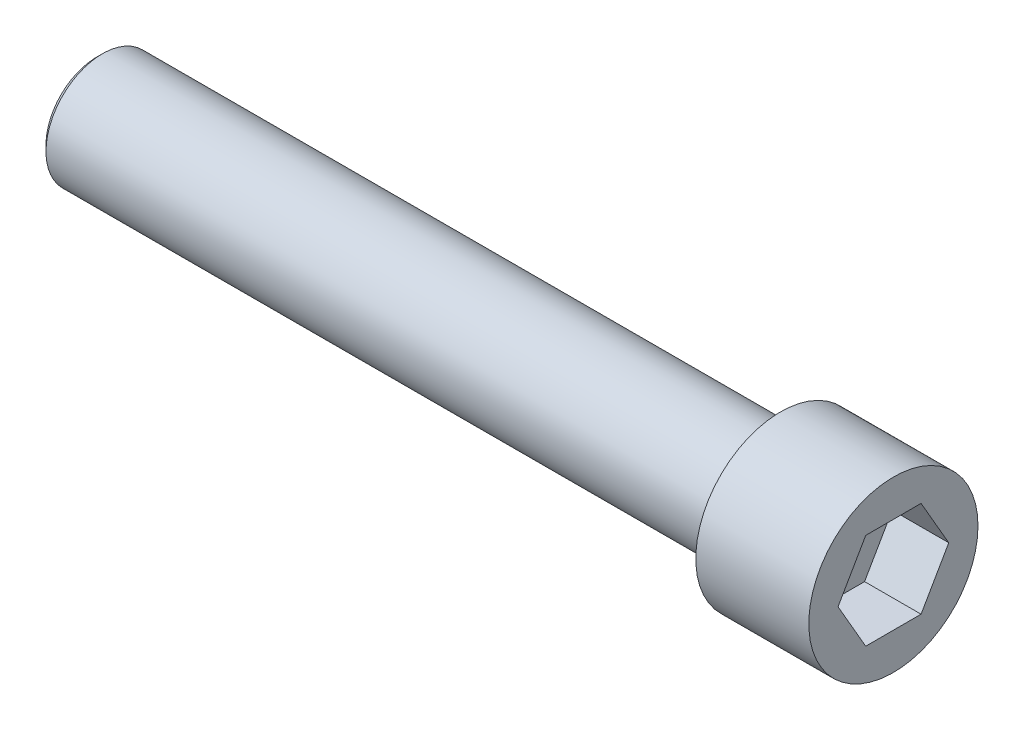
ISO-10303-21;
HEADER;
FILE_DESCRIPTION(('STEP AP214'),'2;1');
FILE_NAME('part.step','',(''),(''),'','','');
FILE_SCHEMA(('AUTOMOTIVE_DESIGN { 1 0 10303 214 1 1 1 1 }'));
ENDSEC;
DATA;
#1=APPLICATION_CONTEXT('core data for automotive mechanical design processes');
#2=APPLICATION_PROTOCOL_DEFINITION('international standard','automotive_design',2000,#1);
#3=PRODUCT_CONTEXT('',#1,'mechanical');
#4=PRODUCT('Part','Part','',(#3));
#5=PRODUCT_RELATED_PRODUCT_CATEGORY('part','',(#4));
#6=PRODUCT_DEFINITION_FORMATION('','',#4);
#7=PRODUCT_DEFINITION_CONTEXT('part definition',#1,'design');
#8=PRODUCT_DEFINITION('design','',#6,#7);
#9=PRODUCT_DEFINITION_SHAPE('','',#8);
#10=(LENGTH_UNIT() NAMED_UNIT(*) SI_UNIT(.MILLI.,.METRE.));
#11=(NAMED_UNIT(*) PLANE_ANGLE_UNIT() SI_UNIT($,.RADIAN.));
#12=(NAMED_UNIT(*) SI_UNIT($,.STERADIAN.) SOLID_ANGLE_UNIT());
#13=UNCERTAINTY_MEASURE_WITH_UNIT(LENGTH_MEASURE(1.E-05),#10,'distance_accuracy_value','');
#14=(GEOMETRIC_REPRESENTATION_CONTEXT(3) GLOBAL_UNCERTAINTY_ASSIGNED_CONTEXT((#13)) GLOBAL_UNIT_ASSIGNED_CONTEXT((#10,
#11,#12)) REPRESENTATION_CONTEXT('',''));
#15=CARTESIAN_POINT('',(0.,0.,0.));
#16=DIRECTION('',(0.,0.,1.));
#17=DIRECTION('',(1.,0.,0.));
#18=AXIS2_PLACEMENT_3D('',#15,#16,#17);
#19=CARTESIAN_POINT('',(-2985.09814387613,-2632.99425134609,-957.181157954976));
#20=DIRECTION('',(-0.99999962622111,9.96744033232361E-06,0.000864556701465126));
#21=DIRECTION('',(9.96744405744865E-06,0.999999999950325,0.));
#22=AXIS2_PLACEMENT_3D('',#19,#20,#21);
#23=PLANE('',#22);
#24=CARTESIAN_POINT('',(-2985.10203438085,-2632.99420649261,-961.681156272962));
#25=DIRECTION('',(-0.99999962622111,9.96744033232361E-06,0.000864556701465125));
#26=DIRECTION('',(0.000864556602115295,-9.96744034816775E-06,0.999999626221196));
#27=AXIS2_PLACEMENT_3D('',#24,#25,#26);
#28=CIRCLE('',#27,9.);
#29=CARTESIAN_POINT('',(-2985.10981539072,-2632.99411678565,-970.6811529094));
#30=VERTEX_POINT('',#29);
#31=EDGE_CURVE('E138',#30,#30,#28,.T.);
#32=ORIENTED_EDGE('',*,*,#31,.T.);
#33=EDGE_LOOP('',(#32));
#34=FACE_BOUND('',#33,.T.);
#35=ADVANCED_FACE('F17',(#34),#23,.T.);
#36=CARTESIAN_POINT('',(-2844.10936095089,-2632.99484626083,-971.618459251404));
#37=DIRECTION('',(-0.000743739953429566,0.500008632006878,-0.866020100672896));
#38=DIRECTION('',(-0.999999631229609,0.,0.000858801866818574));
#39=AXIS2_PLACEMENT_3D('',#36,#37,#38);
#40=PLANE('',#39);
#41=DIRECTION('',(0.000440917817272284,0.866020419978039,0.500008437701345));
#42=VECTOR('',#41,1.);
#43=CARTESIAN_POINT('',(-2854.10935721309,-2632.99474658641,-971.6098136844));
#44=LINE('',#43,#42);
#45=CARTESIAN_POINT('',(-2854.1093572131,-2632.99474658642,-971.60981368439));
#46=VERTEX_POINT('',#45);
#47=CARTESIAN_POINT('',(-2854.10502962475,-2624.49479550226,-966.702253580626));
#48=VERTEX_POINT('',#47);
#49=EDGE_CURVE('E49',#46,#48,#44,.T.);
#50=ORIENTED_EDGE('',*,*,#49,.F.);
#51=DIRECTION('',(-0.99999962622111,9.9674403323236E-06,0.000864556701465125));
#52=VECTOR('',#51,1.);
#53=CARTESIAN_POINT('',(-2844.10936095088,-2632.99484626082,-971.618459251414));
#54=LINE('',#53,#52);
#55=CARTESIAN_POINT('',(-2844.10936095089,-2632.99484626083,-971.618459251404));
#56=VERTEX_POINT('',#55);
#57=EDGE_CURVE('E157',#56,#46,#54,.T.);
#58=ORIENTED_EDGE('',*,*,#57,.F.);
#59=DIRECTION('',(-0.000440917817272284,-0.866020419978039,-0.500008437701345));
#60=VECTOR('',#59,1.);
#61=CARTESIAN_POINT('',(-2844.10503336253,-2624.49489517665,-966.71089914765));
#62=LINE('',#61,#60);
#63=CARTESIAN_POINT('',(-2844.10503336254,-2624.49489517666,-966.71089914764));
#64=VERTEX_POINT('',#63);
#65=EDGE_CURVE('E11',#64,#56,#62,.T.);
#66=ORIENTED_EDGE('',*,*,#65,.F.);
#67=DIRECTION('',(-0.99999962622111,9.9674403323236E-06,0.000864556701465125));
#68=VECTOR('',#67,1.);
#69=CARTESIAN_POINT('',(-2844.10503336253,-2624.49489517665,-966.71089914765));
#70=LINE('',#69,#68);
#71=EDGE_CURVE('E174',#64,#48,#70,.T.);
#72=ORIENTED_EDGE('',*,*,#71,.T.);
#73=EDGE_LOOP('',(#50,#58,#66,#72));
#74=FACE_BOUND('',#73,.T.);
#75=ADVANCED_FACE('F238',(#74),#40,.F.);
#76=CARTESIAN_POINT('',(-2844.09654777876,-2624.49499300663,-956.895948240038));
#77=DIRECTION('',(0.000753716007453621,0.499991367893773,0.866030059492102));
#78=DIRECTION('',(0.999998863787065,-0.00150745632718978,0.));
#79=AXIS2_PLACEMENT_3D('',#76,#77,#78);
#80=PLANE('',#79);
#81=DIRECTION('',(0.000423638784843571,-0.866030387418387,0.499991188520497));
#82=VECTOR('',#81,1.);
#83=CARTESIAN_POINT('',(-2854.09654404096,-2624.49489333222,-956.887302673014));
#84=LINE('',#83,#82);
#85=CARTESIAN_POINT('',(-2854.09654404097,-2624.49489333223,-956.887302673024));
#86=VERTEX_POINT('',#85);
#87=CARTESIAN_POINT('',(-2854.09238604554,-2632.99494224637,-951.979911869186));
#88=VERTEX_POINT('',#87);
#89=EDGE_CURVE('E152',#86,#88,#84,.T.);
#90=ORIENTED_EDGE('',*,*,#89,.F.);
#91=DIRECTION('',(-0.99999962622111,9.9674403323236E-06,0.000864556701465125));
#92=VECTOR('',#91,1.);
#93=CARTESIAN_POINT('',(-2844.09654777875,-2624.49499300662,-956.895948240028));
#94=LINE('',#93,#92);
#95=CARTESIAN_POINT('',(-2844.09654777876,-2624.49499300663,-956.895948240038));
#96=VERTEX_POINT('',#95);
#97=EDGE_CURVE('E167',#96,#86,#94,.T.);
#98=ORIENTED_EDGE('',*,*,#97,.F.);
#99=DIRECTION('',(-0.000423638784843571,0.866030387418387,-0.499991188520497));
#100=VECTOR('',#99,1.);
#101=CARTESIAN_POINT('',(-2844.09238978332,-2632.99504192079,-951.988557436191));
#102=LINE('',#101,#100);
#103=CARTESIAN_POINT('',(-2844.09238978333,-2632.99504192078,-951.988557436201));
#104=VERTEX_POINT('',#103);
#105=EDGE_CURVE('E29',#104,#96,#102,.T.);
#106=ORIENTED_EDGE('',*,*,#105,.F.);
#107=DIRECTION('',(-0.99999962622111,9.9674403323236E-06,0.000864556701465125));
#108=VECTOR('',#107,1.);
#109=CARTESIAN_POINT('',(-2844.09238978332,-2632.99504192079,-951.988557436191));
#110=LINE('',#109,#108);
#111=EDGE_CURVE('E187',#104,#88,#110,.T.);
#112=ORIENTED_EDGE('',*,*,#111,.T.);
#113=EDGE_LOOP('',(#90,#98,#106,#112));
#114=FACE_BOUND('',#113,.T.);
#115=ADVANCED_FACE('F19',(#114),#80,.F.);
#116=CARTESIAN_POINT('',(-2844.09439119259,-2632.9950188466,-954.303511147144));
#117=DIRECTION('',(0.99999962622111,-9.96744033232361E-06,-0.000864556701465126));
#118=DIRECTION('',(0.,-0.999933548155638,0.0115281946928868));
#119=AXIS2_PLACEMENT_3D('',#116,#117,#118);
#120=PLANE('',#119);
#121=DIRECTION('',(0.000440917817272284,0.866020419978039,0.500008437701345));
#122=VECTOR('',#121,1.);
#123=CARTESIAN_POINT('',(-2844.09671737167,-2641.49499300496,-956.896117539955));
#124=LINE('',#123,#122);
#125=CARTESIAN_POINT('',(-2844.09671737168,-2641.49499300494,-956.896117539965));
#126=VERTEX_POINT('',#125);
#127=EDGE_CURVE('E182',#126,#104,#124,.T.);
#128=ORIENTED_EDGE('',*,*,#127,.T.);
#129=ORIENTED_EDGE('',*,*,#105,.T.);
#130=DIRECTION('',(-0.000864556602115296,9.96744034816775E-06,-0.999999626221196));
#131=VECTOR('',#130,1.);
#132=CARTESIAN_POINT('',(-2844.09654777875,-2624.49499300662,-956.895948240028));
#133=LINE('',#132,#131);
#134=EDGE_CURVE('E171',#96,#64,#133,.T.);
#135=ORIENTED_EDGE('',*,*,#134,.T.);
#136=ORIENTED_EDGE('',*,*,#65,.T.);
#137=DIRECTION('',(0.00042363878484357,-0.866030387418387,0.499991188520496));
#138=VECTOR('',#137,1.);
#139=CARTESIAN_POINT('',(-2844.10936095088,-2632.99484626082,-971.618459251414));
#140=LINE('',#139,#138);
#141=CARTESIAN_POINT('',(-2844.10520295546,-2641.49489517497,-966.711068447567));
#142=VERTEX_POINT('',#141);
#143=EDGE_CURVE('E160',#56,#142,#140,.T.);
#144=ORIENTED_EDGE('',*,*,#143,.T.);
#145=DIRECTION('',(0.000864556602115296,-9.96744034816775E-06,0.999999626221196));
#146=VECTOR('',#145,1.);
#147=CARTESIAN_POINT('',(-2844.10520295545,-2641.49489517498,-966.711068447577));
#148=LINE('',#147,#146);
#149=EDGE_CURVE('E195',#142,#126,#148,.T.);
#150=ORIENTED_EDGE('',*,*,#149,.T.);
#151=EDGE_LOOP('',(#128,#129,#135,#136,#144,#150));
#152=FACE_BOUND('',#151,.T.);
#153=CARTESIAN_POINT('',(-2844.1008753671,-2632.9949440908,-961.803508343813));
#154=DIRECTION('',(-0.99999962622111,9.96744033232361E-06,0.000864556701465126));
#155=DIRECTION('',(0.000864556602115296,-9.96744034816775E-06,0.999999626221196));
#156=AXIS2_PLACEMENT_3D('',#153,#154,#155);
#157=CIRCLE('',#156,15.);
#158=CARTESIAN_POINT('',(-2844.11384371613,-2632.9947945792,-976.803502737121));
#159=VERTEX_POINT('',#158);
#160=EDGE_CURVE('E203',#159,#159,#157,.T.);
#161=ORIENTED_EDGE('',*,*,#160,.F.);
#162=EDGE_LOOP('',(#161));
#163=FACE_BOUND('',#162,.T.);
#164=ADVANCED_FACE('F232',(#152,#163),#120,.T.);
#165=CARTESIAN_POINT('',(-2854.10087162932,-2632.9948444164,-961.794862776788));
#166=DIRECTION('',(-0.99999962622111,9.96744033232361E-06,0.000864556701465126));
#167=DIRECTION('',(9.96744405744865E-06,0.999999999950325,0.));
#168=AXIS2_PLACEMENT_3D('',#165,#166,#167);
#169=PLANE('',#168);
#170=DIRECTION('',(-0.000440917817272283,-0.866020419978039,-0.500008437701345));
#171=VECTOR('',#170,1.);
#172=CARTESIAN_POINT('',(-2854.09238604553,-2632.99494224638,-951.979911869176));
#173=LINE('',#172,#171);
#174=CARTESIAN_POINT('',(-2854.09671363389,-2641.49489333054,-956.88747197295));
#175=VERTEX_POINT('',#174);
#176=EDGE_CURVE('E199',#88,#175,#173,.T.);
#177=ORIENTED_EDGE('',*,*,#176,.T.);
#178=DIRECTION('',(-0.000864556602115296,9.96744034816775E-06,-0.999999626221196));
#179=VECTOR('',#178,1.);
#180=CARTESIAN_POINT('',(-2854.09671363388,-2641.49489333055,-956.88747197294));
#181=LINE('',#180,#179);
#182=CARTESIAN_POINT('',(-2854.10519921767,-2641.49479550057,-966.702422880552));
#183=VERTEX_POINT('',#182);
#184=EDGE_CURVE('E191',#175,#183,#181,.T.);
#185=ORIENTED_EDGE('',*,*,#184,.T.);
#186=DIRECTION('',(-0.00042363878484357,0.866030387418387,-0.499991188520496));
#187=VECTOR('',#186,1.);
#188=CARTESIAN_POINT('',(-2854.10519921766,-2641.49479550058,-966.702422880562));
#189=LINE('',#188,#187);
#190=EDGE_CURVE('E163',#183,#46,#189,.T.);
#191=ORIENTED_EDGE('',*,*,#190,.T.);
#192=ORIENTED_EDGE('',*,*,#49,.T.);
#193=DIRECTION('',(0.000864556602115296,-9.96744034816775E-06,0.999999626221196));
#194=VECTOR('',#193,1.);
#195=CARTESIAN_POINT('',(-2854.10502962474,-2624.49479550225,-966.702253580635));
#196=LINE('',#195,#194);
#197=EDGE_CURVE('E177',#48,#86,#196,.T.);
#198=ORIENTED_EDGE('',*,*,#197,.T.);
#199=ORIENTED_EDGE('',*,*,#89,.T.);
#200=EDGE_LOOP('',(#177,#185,#191,#192,#198,#199));
#201=FACE_BOUND('',#200,.T.);
#202=ADVANCED_FACE('F221',(#201),#169,.F.);
#203=CARTESIAN_POINT('',(-2844.10520295546,-2641.49489517497,-966.711068447567));
#204=DIRECTION('',(-0.000753716007453621,-0.499991367893773,-0.866030059492102));
#205=DIRECTION('',(0.,-0.866030305482771,0.499991509913337));
#206=AXIS2_PLACEMENT_3D('',#203,#204,#205);
#207=PLANE('',#206);
#208=ORIENTED_EDGE('',*,*,#190,.F.);
#209=DIRECTION('',(-0.99999962622111,9.9674403323236E-06,0.000864556701465125));
#210=VECTOR('',#209,1.);
#211=CARTESIAN_POINT('',(-2844.10520295545,-2641.49489517498,-966.711068447577));
#212=LINE('',#211,#210);
#213=EDGE_CURVE('E181',#142,#183,#212,.T.);
#214=ORIENTED_EDGE('',*,*,#213,.F.);
#215=ORIENTED_EDGE('',*,*,#143,.F.);
#216=ORIENTED_EDGE('',*,*,#57,.T.);
#217=EDGE_LOOP('',(#208,#214,#215,#216));
#218=FACE_BOUND('',#217,.T.);
#219=ADVANCED_FACE('F237',(#218),#207,.F.);
#220=CARTESIAN_POINT('',(-2844.10503336254,-2624.49489517666,-966.71089914764));
#221=DIRECTION('',(9.97605402405514E-06,0.99999999990065,9.95881920620346E-06));
#222=DIRECTION('',(0.706495183611375,0.,-0.707717850229828));
#223=AXIS2_PLACEMENT_3D('',#220,#221,#222);
#224=PLANE('',#223);
#225=ORIENTED_EDGE('',*,*,#197,.F.);
#226=ORIENTED_EDGE('',*,*,#71,.F.);
#227=ORIENTED_EDGE('',*,*,#134,.F.);
#228=ORIENTED_EDGE('',*,*,#97,.T.);
#229=EDGE_LOOP('',(#225,#226,#227,#228));
#230=FACE_BOUND('',#229,.T.);
#231=ADVANCED_FACE('F243',(#230),#224,.F.);
#232=CARTESIAN_POINT('',(-2844.09671737168,-2641.49499300494,-956.896117539965));
#233=DIRECTION('',(-9.97605402405514E-06,-0.99999999990065,-9.95881920620346E-06));
#234=DIRECTION('',(-0.999999999950239,9.97605402454984E-06,0.));
#235=AXIS2_PLACEMENT_3D('',#232,#233,#234);
#236=PLANE('',#235);
#237=ORIENTED_EDGE('',*,*,#184,.F.);
#238=DIRECTION('',(-0.99999962622111,9.9674403323236E-06,0.000864556701465125));
#239=VECTOR('',#238,1.);
#240=CARTESIAN_POINT('',(-2844.09671737167,-2641.49499300496,-956.896117539955));
#241=LINE('',#240,#239);
#242=EDGE_CURVE('E186',#126,#175,#241,.T.);
#243=ORIENTED_EDGE('',*,*,#242,.F.);
#244=ORIENTED_EDGE('',*,*,#149,.F.);
#245=ORIENTED_EDGE('',*,*,#213,.T.);
#246=EDGE_LOOP('',(#237,#243,#244,#245));
#247=FACE_BOUND('',#246,.T.);
#248=ADVANCED_FACE('F225',(#247),#236,.F.);
#249=CARTESIAN_POINT('',(-2844.09238978333,-2632.99504192078,-951.988557436201));
#250=DIRECTION('',(0.000743739953429566,-0.500008632006878,0.866020100672896));
#251=DIRECTION('',(-0.999998893741797,-0.00148745258192045,0.));
#252=AXIS2_PLACEMENT_3D('',#249,#250,#251);
#253=PLANE('',#252);
#254=ORIENTED_EDGE('',*,*,#176,.F.);
#255=ORIENTED_EDGE('',*,*,#111,.F.);
#256=ORIENTED_EDGE('',*,*,#127,.F.);
#257=ORIENTED_EDGE('',*,*,#242,.T.);
#258=EDGE_LOOP('',(#254,#255,#256,#257));
#259=FACE_BOUND('',#258,.T.);
#260=ADVANCED_FACE('F230',(#259),#253,.F.);
#261=CARTESIAN_POINT('',(-2854.10087162932,-2632.9948444164,-961.794862776788));
#262=DIRECTION('',(0.99999962622111,-9.96744033232362E-06,-0.000864556701465126));
#263=DIRECTION('',(0.000864556602115296,-9.96744034816775E-06,0.999999626221196));
#264=AXIS2_PLACEMENT_3D('',#261,#262,#263);
#265=CYLINDRICAL_SURFACE('',#264,15.);
#266=ORIENTED_EDGE('',*,*,#160,.T.);
#267=DIRECTION('',(-0.99999962622111,9.96744033232361E-06,0.000864556701465126));
#268=VECTOR('',#267,1.);
#269=CARTESIAN_POINT('',(-2854.11383997835,-2632.99469490479,-976.794857170106));
#270=LINE('',#269,#268);
#271=CARTESIAN_POINT('',(-2864.11383624055,-2632.99459523039,-976.786211603091));
#272=VERTEX_POINT('',#271);
#273=EDGE_CURVE('E200',#159,#272,#270,.T.);
#274=ORIENTED_EDGE('',*,*,#273,.T.);
#275=CARTESIAN_POINT('',(-2864.10086789152,-2632.994744742,-961.786217209783));
#276=DIRECTION('',(-0.99999962622111,9.96744033232361E-06,0.000864556701465126));
#277=DIRECTION('',(0.000864556602115296,-9.96744034816775E-06,0.999999626221196));
#278=AXIS2_PLACEMENT_3D('',#275,#276,#277);
#279=CIRCLE('',#278,15.);
#280=EDGE_CURVE('E207',#272,#272,#279,.T.);
#281=ORIENTED_EDGE('',*,*,#280,.F.);
#282=ORIENTED_EDGE('',*,*,#273,.F.);
#283=EDGE_LOOP('',(#266,#274,#281,#282));
#284=FACE_BOUND('',#283,.T.);
#285=ADVANCED_FACE('F258',(#284),#265,.T.);
#286=CARTESIAN_POINT('',(-2864.09006093401,-2632.994869335,-949.286221882008));
#287=DIRECTION('',(-0.99999962622111,9.96744033232361E-06,0.000864556701465126));
#288=DIRECTION('',(9.96744405744865E-06,0.999999999950325,0.));
#289=AXIS2_PLACEMENT_3D('',#286,#287,#288);
#290=PLANE('',#289);
#291=CARTESIAN_POINT('',(-2864.10086789173,-2632.99476467688,-961.786217209972));
#292=DIRECTION('',(-0.99999962622111,9.96744033232361E-06,0.000864556701465126));
#293=DIRECTION('',(0.000864556602115296,-9.96744034816775E-06,0.999999626221196));
#294=AXIS2_PLACEMENT_3D('',#291,#292,#293);
#295=CIRCLE('',#294,10.);
#296=CARTESIAN_POINT('',(-2864.10951345775,-2632.99466500247,-971.786213472184));
#297=VERTEX_POINT('',#296);
#298=EDGE_CURVE('E122',#297,#297,#295,.T.);
#299=ORIENTED_EDGE('',*,*,#298,.F.);
#300=EDGE_LOOP('',(#299));
#301=FACE_BOUND('',#300,.T.);
#302=ORIENTED_EDGE('',*,*,#280,.T.);
#303=EDGE_LOOP('',(#302));
#304=FACE_BOUND('',#303,.T.);
#305=ADVANCED_FACE('F261',(#301,#304),#290,.T.);
#306=CARTESIAN_POINT('',(-2882.10086116351,-2632.99458526295,-961.770655189346));
#307=DIRECTION('',(0.99999962622111,-9.96744033232361E-06,-0.000864556701465126));
#308=DIRECTION('',(0.000864556602115296,-9.96744034816775E-06,0.999999626221196));
#309=AXIS2_PLACEMENT_3D('',#306,#307,#308);
#310=CYLINDRICAL_SURFACE('',#309,10.);
#311=DIRECTION('',(-0.99999962622111,9.96744033232361E-06,0.000864556701465126));
#312=VECTOR('',#311,1.);
#313=CARTESIAN_POINT('',(-2882.10950672953,-2632.99448558855,-971.770651451558));
#314=LINE('',#313,#312);
#315=CARTESIAN_POINT('',(-2984.11023216963,-2632.99379272047,-971.682466000599));
#316=VERTEX_POINT('',#315);
#317=EDGE_CURVE('E114',#297,#316,#314,.T.);
#318=ORIENTED_EDGE('',*,*,#317,.F.);
#319=ORIENTED_EDGE('',*,*,#298,.T.);
#320=ORIENTED_EDGE('',*,*,#317,.T.);
#321=CARTESIAN_POINT('',(-2984.09383813114,-2632.99431612551,-951.682472735296));
#322=CARTESIAN_POINT('',(-2984.09383181942,-2632.8307019418,-951.682462967038));
#323=CARTESIAN_POINT('',(-2984.09382898532,-2632.66708789901,-951.686475626787));
#324=CARTESIAN_POINT('',(-2984.09383025475,-2632.34025326094,-951.702520898761));
#325=CARTESIAN_POINT('',(-2984.09383435829,-2632.17703266623,-951.714553522227));
#326=CARTESIAN_POINT('',(-2984.0938494854,-2631.85137832268,-951.746613840452));
#327=CARTESIAN_POINT('',(-2984.09386050899,-2631.68894457495,-951.76664154642));
#328=CARTESIAN_POINT('',(-2984.09388943746,-2631.36525517479,-951.814642711585));
#329=CARTESIAN_POINT('',(-2984.09390734236,-2631.20399952401,-951.842616181922));
#330=CARTESIAN_POINT('',(-2984.09394997933,-2630.88305479842,-951.906441803484));
#331=CARTESIAN_POINT('',(-2984.09397471142,-2630.72336572581,-951.942293965752));
#332=CARTESIAN_POINT('',(-2984.0940309319,-2630.40593884619,-952.021790547294));
#333=CARTESIAN_POINT('',(-2984.0940624203,-2630.24820104192,-952.065434977489));
#334=CARTESIAN_POINT('',(-2984.09413206632,-2629.93505669402,-952.160410998865));
#335=CARTESIAN_POINT('',(-2984.09417022395,-2629.77965015365,-952.211742600822));
#336=CARTESIAN_POINT('',(-2984.09425310528,-2629.47154271233,-952.321969324417));
#337=CARTESIAN_POINT('',(-2984.09429782899,-2629.31884181518,-952.380864456657));
#338=CARTESIAN_POINT('',(-2984.09439372348,-2629.01651352262,-952.506076385863));
#339=CARTESIAN_POINT('',(-2984.09444489428,-2628.86688613152,-952.572393193232));
#340=CARTESIAN_POINT('',(-2984.09455354846,-2628.5710653103,-952.712288736697));
#341=CARTESIAN_POINT('',(-2984.09461103185,-2628.42487188499,-952.785867482972));
#342=CARTESIAN_POINT('',(-2984.0947321615,-2628.13627118323,-952.940109674392));
#343=CARTESIAN_POINT('',(-2984.09479580776,-2627.99386391208,-953.020773129467));
#344=CARTESIAN_POINT('',(-2984.09492909859,-2627.71317858669,-953.188990441012));
#345=CARTESIAN_POINT('',(-2984.09499874316,-2627.57490053824,-953.276544307142));
#346=CARTESIAN_POINT('',(-2984.0951438516,-2627.30280678001,-953.458331543896));
#347=CARTESIAN_POINT('',(-2984.09521931547,-2627.1689910765,-953.552564923883));
#348=CARTESIAN_POINT('',(-2984.09537586947,-2626.90614438112,-953.747484199982));
#349=CARTESIAN_POINT('',(-2984.09545695961,-2626.77711339596,-953.848170105138));
#350=CARTESIAN_POINT('',(-2984.09562455956,-2626.52414698484,-954.05575189851));
#351=CARTESIAN_POINT('',(-2984.09571106939,-2626.40021156602,-954.162647795431));
#352=CARTESIAN_POINT('',(-2984.09588928906,-2626.15773486082,-954.382392078794));
#353=CARTESIAN_POINT('',(-2984.09598099892,-2626.03919358201,-954.495240473579));
#354=CARTESIAN_POINT('',(-2984.09616938651,-2625.8077907365,-954.726617918908));
#355=CARTESIAN_POINT('',(-2984.09626606424,-2625.69492917777,-954.845146977415));
#356=CARTESIAN_POINT('',(-2984.09646414342,-2625.47515767051,-955.087600231014));
#357=CARTESIAN_POINT('',(-2984.09656554489,-2625.36824773034,-955.211524433669));
#358=CARTESIAN_POINT('',(-2984.09677281602,-2625.16063702167,-955.46446945875));
#359=CARTESIAN_POINT('',(-2984.0968786857,-2625.05993626188,-955.59349028832));
#360=CARTESIAN_POINT('',(-2984.09709462698,-2624.86498651835,-955.856317771866));
#361=CARTESIAN_POINT('',(-2984.09720469859,-2624.77073754365,-955.99012443255));
#362=CARTESIAN_POINT('',(-2984.09742876733,-2624.58891843306,-956.262201253078));
#363=CARTESIAN_POINT('',(-2984.09754276446,-2624.50134830653,-956.400471419178));
#364=CARTESIAN_POINT('',(-2984.09777439839,-2624.3330978664,-956.681142171853));
#365=CARTESIAN_POINT('',(-2984.09789203519,-2624.25241756246,-956.823542764218));
#366=CARTESIAN_POINT('',(-2984.09813065381,-2624.09814114474,-957.112131339657));
#367=CARTESIAN_POINT('',(-2984.09825163564,-2624.02454504089,-957.258319328041));
#368=CARTESIAN_POINT('',(-2984.09849664163,-2623.88461433536,-957.554130540999));
#369=CARTESIAN_POINT('',(-2984.0986206658,-2623.81827974385,-957.703753770387));
#370=CARTESIAN_POINT('',(-2984.09887144646,-2623.69303188262,-958.006075034394));
#371=CARTESIAN_POINT('',(-2984.09899820295,-2623.63411862329,-958.158773073321));
#372=CARTESIAN_POINT('',(-2984.09925413164,-2623.52385536857,-958.46687611725));
#373=CARTESIAN_POINT('',(-2984.09938330385,-2623.47250538378,-958.622281126047));
#374=CARTESIAN_POINT('',(-2984.09964374155,-2623.37749240085,-958.935423748473));
#375=CARTESIAN_POINT('',(-2984.09977500705,-2623.33382941348,-959.093161365371));
#376=CARTESIAN_POINT('',(-2984.10003930386,-2623.25429563057,-959.410589222484));
#377=CARTESIAN_POINT('',(-2984.10017233519,-2623.21842484594,-959.570279465434));
#378=CARTESIAN_POINT('',(-2984.10043983194,-2623.15456190266,-959.891227888214));
#379=CARTESIAN_POINT('',(-2984.10057429736,-2623.12656975505,-960.052486070241));
#380=CARTESIAN_POINT('',(-2984.10084432714,-2623.07853154063,-960.376181906513));
#381=CARTESIAN_POINT('',(-2984.10097989149,-2623.05848548496,-960.53861956241));
#382=CARTESIAN_POINT('',(-2984.10125178128,-2623.02638776742,-960.864283039332));
#383=CARTESIAN_POINT('',(-2984.10138810673,-2623.01433611676,-961.027508861462));
#384=CARTESIAN_POINT('',(-2984.10166117907,-2622.99825626393,-961.35435546398));
#385=CARTESIAN_POINT('',(-2984.10179792595,-2622.99422807301,-961.517976244922));
#386=CARTESIAN_POINT('',(-2984.10207150049,-2622.99420486602,-961.845218605641));
#387=CARTESIAN_POINT('',(-2984.10220832814,-2622.99820986121,-962.008840185418));
#388=CARTESIAN_POINT('',(-2984.10248172332,-2623.01424340099,-962.335689981357));
#389=CARTESIAN_POINT('',(-2984.10261829086,-2623.02627195681,-962.498918196967));
#390=CARTESIAN_POINT('',(-2984.10289082557,-2623.0583236637,-962.824588048621));
#391=CARTESIAN_POINT('',(-2984.10302679275,-2623.07834682597,-962.987029683562));
#392=CARTESIAN_POINT('',(-2984.10329778795,-2623.12633953259,-963.310735051694));
#393=CARTESIAN_POINT('',(-2984.10343281597,-2623.15430908808,-963.471998783233));
#394=CARTESIAN_POINT('',(-2984.10370159631,-2623.21812722508,-963.792959858832));
#395=CARTESIAN_POINT('',(-2984.10383534863,-2623.25397581764,-963.952657200696));
#396=CARTESIAN_POINT('',(-2984.1041012441,-2623.33346569205,-964.270100783541));
#397=CARTESIAN_POINT('',(-2984.10423338726,-2623.37710698481,-964.427847021787));
#398=CARTESIAN_POINT('',(-2984.1044957348,-2623.4720771501,-964.741008383102));
#399=CARTESIAN_POINT('',(-2984.1046259392,-2623.52340603341,-964.896423502902));
#400=CARTESIAN_POINT('',(-2984.10488408431,-2623.63362775065,-965.2045482276));
#401=CARTESIAN_POINT('',(-2984.10501202502,-2623.6925205952,-965.357257828706));
#402=CARTESIAN_POINT('',(-2984.10526532329,-2623.81772838396,-965.659603632804));
#403=CARTESIAN_POINT('',(-2984.10539068085,-2623.88404333859,-965.809239831488));
#404=CARTESIAN_POINT('',(-2984.10563849957,-2624.02393561636,-966.105078350291));
#405=CARTESIAN_POINT('',(-2984.10576096073,-2624.0975129497,-966.251280665596));
#406=CARTESIAN_POINT('',(-2984.10600268038,-2624.25175275833,-966.539899208365));
#407=CARTESIAN_POINT('',(-2984.10612193887,-2624.33241524356,-966.68231543052));
#408=CARTESIAN_POINT('',(-2984.10635695461,-2624.50063106086,-966.963018697377));
#409=CARTESIAN_POINT('',(-2984.10647271187,-2624.5881844026,-967.10130573629));
#410=CARTESIAN_POINT('',(-2984.10670043503,-2624.76997103725,-967.373417493243));
#411=CARTESIAN_POINT('',(-2984.10681240093,-2624.86420433954,-967.507242205028));
#412=CARTESIAN_POINT('',(-2984.1070322604,-2625.05912390711,-967.770106913066));
#413=CARTESIAN_POINT('',(-2984.10714015395,-2625.15981018144,-967.899146902611));
#414=CARTESIAN_POINT('',(-2984.10735159754,-2625.36739315913,-968.152131296947));
#415=CARTESIAN_POINT('',(-2984.10745514757,-2625.47428987121,-968.276075694593));
#416=CARTESIAN_POINT('',(-2984.10765764339,-2625.69403622887,-968.518570310257));
#417=CARTESIAN_POINT('',(-2984.10775658917,-2625.80688588281,-968.637120520713));
#418=CARTESIAN_POINT('',(-2984.10794962687,-2626.03826628741,-968.868541160817));
#419=CARTESIAN_POINT('',(-2984.10804371877,-2626.15679704603,-968.981411582505));
#420=CARTESIAN_POINT('',(-2984.10822681078,-2626.39925413672,-969.201200725638));
#421=CARTESIAN_POINT('',(-2984.10831581088,-2626.52318047635,-969.308119438742));
#422=CARTESIAN_POINT('',(-2984.10848849359,-2626.77613020707,-969.515747582108));
#423=CARTESIAN_POINT('',(-2984.10857217621,-2626.90515360532,-969.616457003668));
#424=CARTESIAN_POINT('',(-2984.1087340111,-2627.16798665171,-969.811423938735));
#425=CARTESIAN_POINT('',(-2984.10881216337,-2627.30179630657,-969.905681443199));
#426=CARTESIAN_POINT('',(-2984.10896273803,-2627.57387953373,-970.087517460775));
#427=CARTESIAN_POINT('',(-2984.10903516042,-2627.71215311229,-970.175095964525));
#428=CARTESIAN_POINT('',(-2984.10917408958,-2627.99283109992,-970.343362986378));
#429=CARTESIAN_POINT('',(-2984.10924059635,-2628.1352355148,-970.424051494824));
#430=CARTESIAN_POINT('',(-2984.10936752278,-2628.42383213608,-970.578344129065));
#431=CARTESIAN_POINT('',(-2984.10942794244,-2628.57002434781,-970.651948244931));
#432=CARTESIAN_POINT('',(-2984.10954253784,-2628.8658443981,-970.791894762819));
#433=CARTESIAN_POINT('',(-2984.10959671357,-2629.01547224148,-970.858237154662));
#434=CARTESIAN_POINT('',(-2984.10969867933,-2629.317803113,-970.983500385711));
#435=CARTESIAN_POINT('',(-2984.10974646935,-2629.47050614546,-971.042421214513));
#436=CARTESIAN_POINT('',(-2984.10983553728,-2629.77861954389,-971.15269936061));
#437=CARTESIAN_POINT('',(-2984.10987681519,-2629.93402991364,-971.204056667302));
#438=CARTESIAN_POINT('',(-2984.10995274818,-2630.24718361278,-971.299084023197));
#439=CARTESIAN_POINT('',(-2984.10998740326,-2630.40492694542,-971.342754061625));
#440=CARTESIAN_POINT('',(-2984.11004999586,-2630.722366574,-971.422301679887));
#441=CARTESIAN_POINT('',(-2984.11007793337,-2630.88206287267,-971.458179248799));
#442=CARTESIAN_POINT('',(-2984.11012701218,-2631.20302373612,-971.522055399002));
#443=CARTESIAN_POINT('',(-2984.11014815348,-2631.3642883031,-971.550053969249));
#444=CARTESIAN_POINT('',(-2984.11018357792,-2631.68799720871,-971.598104944973));
#445=CARTESIAN_POINT('',(-2984.11019786106,-2631.850441549,-971.618157339311));
#446=CARTESIAN_POINT('',(-2984.11021952255,-2632.17611873179,-971.650266540897));
#447=CARTESIAN_POINT('',(-2984.11022690089,-2632.3393515754,-971.662323336937));
#448=CARTESIAN_POINT('',(-2984.11023472728,-2632.6662123404,-971.678416357977));
#449=CARTESIAN_POINT('',(-2984.11023517531,-2632.82984026233,-971.682452571735));
#450=CARTESIAN_POINT('',(-2984.11023214543,-2632.99346889459,-971.682466007882));
#451=B_SPLINE_CURVE_WITH_KNOTS('',3,(#321,#322,#323,#324,#325,#326,#327,#328,#329,#330,#331,
#332,#333,#334,#335,#336,#337,#338,#339,#340,#341,#342,#343,#344,#345,#346,#347,#348,#349,#350,
#351,#352,#353,#354,#355,#356,#357,#358,#359,#360,#361,#362,#363,#364,#365,#366,#367,#368,#369,
#370,#371,#372,#373,#374,#375,#376,#377,#378,#379,#380,#381,#382,#383,#384,#385,#386,#387,#388,
#389,#390,#391,#392,#393,#394,#395,#396,#397,#398,#399,#400,#401,#402,#403,#404,#405,#406,#407,
#408,#409,#410,#411,#412,#413,#414,#415,#416,#417,#418,#419,#420,#421,#422,#423,#424,#425,#426,
#427,#428,#429,#430,#431,#432,#433,#434,#435,#436,#437,#438,#439,#440,#441,#442,#443,#444,#445,
#446,#447,#448,#449,#450),.UNSPECIFIED.,.F.,.F.,(4,2,2,2,2,2,2,2,2,2,2,2,2,2,2,2,2,2,2,2,2,2,2,
2,2,2,2,2,2,2,2,2,2,2,2,2,2,2,2,2,2,2,2,2,2,2,2,2,2,2,2,2,2,2,2,2,2,2,2,2,2,2,2,2,4),(0.,
0.49079277929273,0.981586246578596,1.47238040185678,1.96317524512753,2.45397077639117,
2.94476699564784,3.43556390289699,3.92636149813883,4.41715978137343,4.90795875260071,
5.39875841182085,5.88955875903341,6.38035979423875,6.87116151743711,7.3619639286279,
7.85276702781145,8.34357081498776,8.83437529015687,9.32518045331876,9.8159863044732,
10.3067928436203,10.7976000707603,11.288407985893,11.7792165890183,12.2700258801363,
12.7608358592471,13.2516465263505,13.7424578814468,14.2332699245357,14.7240826556173,
15.2148960746917,15.7057101817588,16.1965249768186,16.6873404598711,17.1781566309164,
17.6689734899544,18.159791036985,18.6506092720083,19.1414281950245,19.6322478060332,
20.1230681050349,20.6138890920292,21.1047107670161,21.5955331299957,22.0863561809682,
22.5771799199333,23.0680043468912,23.5588294618416,24.0496552647851,24.5404817557209,
25.0313089346495,25.5221368015709,26.0129653564851,26.5037945993921,26.9946245302918,
27.4854551491841,27.9762864560687,28.4671184509465,28.9579511338171,29.4487845046803,
29.9396185635361,30.4304533103848,30.921288745226,31.4121248680602),.UNSPECIFIED.);
#452=CARTESIAN_POINT('',(-2984.09383813114,-2632.99431612551,-951.682472735295));
#453=VERTEX_POINT('',#452);
#454=EDGE_CURVE('E118',#453,#316,#451,.T.);
#455=ORIENTED_EDGE('',*,*,#454,.F.);
#456=CARTESIAN_POINT('',(-2984.11023219385,-2632.99411678564,-971.68246599331));
#457=CARTESIAN_POINT('',(-2984.11023849745,-2633.15774879212,-971.682466417671));
#458=CARTESIAN_POINT('',(-2984.11024132298,-2633.32138042907,-971.67844389819));
#459=CARTESIAN_POINT('',(-2984.11024003553,-2633.64824927925,-971.662377901951));
#460=CARTESIAN_POINT('',(-2984.11023592257,-2633.81148649304,-971.650334436434));
#461=CARTESIAN_POINT('',(-2984.11022077578,-2634.13717304493,-971.618251500874));
#462=CARTESIAN_POINT('',(-2984.11020974197,-2634.29962238413,-971.598212042037));
#463=CARTESIAN_POINT('',(-2984.1101807923,-2634.62334188806,-971.550186513218));
#464=CARTESIAN_POINT('',(-2984.11016287644,-2634.78461205443,-971.522200454374));
#465=CARTESIAN_POINT('',(-2984.11012021687,-2635.10558468764,-971.458348875493));
#466=CARTESIAN_POINT('',(-2984.11009547316,-2635.26528715669,-971.4224833665));
#467=CARTESIAN_POINT('',(-2984.11003922881,-2635.58273966627,-971.342959391111));
#468=CARTESIAN_POINT('',(-2984.11000772819,-2635.74048970954,-971.299300935637));
#469=CARTESIAN_POINT('',(-2984.10993805718,-2636.05365733833,-971.204296245116));
#470=CARTESIAN_POINT('',(-2984.1098998868,-2636.20907492713,-971.152950020843));
#471=CARTESIAN_POINT('',(-2984.10981697949,-2636.5172032392,-971.042693517458));
#472=CARTESIAN_POINT('',(-2984.10977224258,-2636.66991396627,-970.983783248947));
#473=CARTESIAN_POINT('',(-2984.10967632127,-2636.9722606689,-970.858540596764));
#474=CARTESIAN_POINT('',(-2984.10962513688,-2637.12189664876,-970.792208223496));
#475=CARTESIAN_POINT('',(-2984.10951645519,-2637.41773337942,-970.652281183497));
#476=CARTESIAN_POINT('',(-2984.1094589579,-2637.56393413504,-970.578686526945));
#477=CARTESIAN_POINT('',(-2984.1093378002,-2637.8525482164,-970.424412236595));
#478=CARTESIAN_POINT('',(-2984.1092741398,-2637.99496154745,-970.343732612727));
#479=CARTESIAN_POINT('',(-2984.10914082052,-2638.27565770413,-970.175482771904));
#480=CARTESIAN_POINT('',(-2984.10907116165,-2638.41394053553,-970.087912564608));
#481=CARTESIAN_POINT('',(-2984.10892602451,-2638.68604256904,-969.906092540528));
#482=CARTESIAN_POINT('',(-2984.10885054625,-2638.81986177739,-969.811842733107));
#483=CARTESIAN_POINT('',(-2984.10869396345,-2639.08271419509,-969.616890583538));
#484=CARTESIAN_POINT('',(-2984.10861285891,-2639.21174741115,-969.516188250433));
#485=CARTESIAN_POINT('',(-2984.1084452302,-2639.46471700538,-969.308573668315));
#486=CARTESIAN_POINT('',(-2984.10835870604,-2639.58865339068,-969.201661428006));
#487=CARTESIAN_POINT('',(-2984.10818045781,-2639.83113076407,-968.98188460983));
#488=CARTESIAN_POINT('',(-2984.10808873374,-2639.94967175972,-968.869020040306));
#489=CARTESIAN_POINT('',(-2984.10790031794,-2640.18107279327,-968.637610481011));
#490=CARTESIAN_POINT('',(-2984.10780362621,-2640.29393283914,-968.519065499203));
#491=CARTESIAN_POINT('',(-2984.10760551928,-2640.51370009933,-968.276580716498));
#492=CARTESIAN_POINT('',(-2984.10750410409,-2640.620607322,-968.152640923163));
#493=CARTESIAN_POINT('',(-2984.10729680584,-2640.8282114036,-967.899665114339));
#494=CARTESIAN_POINT('',(-2984.10719092278,-2640.92890827124,-967.770629105993));
#495=CARTESIAN_POINT('',(-2984.10697495514,-2641.12384907263,-967.507771740469));
#496=CARTESIAN_POINT('',(-2984.10686487056,-2641.21809301542,-967.373950389999));
#497=CARTESIAN_POINT('',(-2984.10664077635,-2641.39990094329,-967.101844740988));
#498=CARTESIAN_POINT('',(-2984.10652676672,-2641.48746493772,-966.963560448703));
#499=CARTESIAN_POINT('',(-2984.10629510834,-2641.65570203827,-966.682862067537));
#500=CARTESIAN_POINT('',(-2984.10617745959,-2641.73637515405,-966.540447984445));
#501=CARTESIAN_POINT('',(-2984.10593881765,-2641.89063616798,-966.251833121233));
#502=CARTESIAN_POINT('',(-2984.10581782446,-2641.96422407607,-966.105632346421));
#503=CARTESIAN_POINT('',(-2984.10557279641,-2642.10413741479,-965.809796320849));
#504=CARTESIAN_POINT('',(-2984.10544876154,-2642.1704628556,-965.660161074903));
#505=CARTESIAN_POINT('',(-2984.10519796019,-2642.29569149631,-965.357816601095));
#506=CARTESIAN_POINT('',(-2984.10507119371,-2642.35459470661,-965.205107377542));
#507=CARTESIAN_POINT('',(-2984.1048152458,-2642.46483700414,-964.896982847026));
#508=CARTESIAN_POINT('',(-2984.10468606436,-2642.51617610196,-964.741567543855));
#509=CARTESIAN_POINT('',(-2984.10442560901,-2642.61116651533,-964.428405270758));
#510=CARTESIAN_POINT('',(-2984.10429433509,-2642.65481784165,-964.270658304101));
#511=CARTESIAN_POINT('',(-2984.10403002229,-2642.73432757371,-963.953212736817));
#512=CARTESIAN_POINT('',(-2984.1038969834,-2642.77018599038,-963.793514138927));
#513=CARTESIAN_POINT('',(-2984.10362947241,-2642.83402353889,-963.472550042552));
#514=CARTESIAN_POINT('',(-2984.10349500031,-2642.86200268179,-963.311284546263));
#515=CARTESIAN_POINT('',(-2984.10322495812,-2642.91001430066,-962.987575160181));
#516=CARTESIAN_POINT('',(-2984.10308938803,-2642.93004678777,-962.825131272039));
#517=CARTESIAN_POINT('',(-2984.10281748771,-2642.96211685732,-962.499456447099));
#518=CARTESIAN_POINT('',(-2984.10268115748,-2642.97415445098,-962.336225511405));
#519=CARTESIAN_POINT('',(-2984.10240807657,-2642.99020575641,-962.009369831181));
#520=CARTESIAN_POINT('',(-2984.1022713259,-2642.99421947944,-961.845745087203));
#521=CARTESIAN_POINT('',(-2984.1019977448,-2642.9942133967,-961.518495977846));
#522=CARTESIAN_POINT('',(-2984.10186091438,-2642.99019360221,-961.354871612467));
#523=CARTESIAN_POINT('',(-2984.10158751468,-2642.97413019098,-961.028017445728));
#524=CARTESIAN_POINT('',(-2984.1014509454,-2642.96208658549,-960.864787643814));
#525=CARTESIAN_POINT('',(-2984.10117840826,-2642.93000458889,-960.53911583778));
#526=CARTESIAN_POINT('',(-2984.10104244039,-2642.90996620898,-960.376673832556));
#527=CARTESIAN_POINT('',(-2984.10077144487,-2642.86194296015,-960.052968954703));
#528=CARTESIAN_POINT('',(-2984.10063641722,-2642.83395810236,-959.891706080422));
#529=CARTESIAN_POINT('',(-2984.10036763869,-2642.77010933803,-959.57074795753));
#530=CARTESIAN_POINT('',(-2984.10023388781,-2642.73424544253,-959.411052706722));
#531=CARTESIAN_POINT('',(-2984.09996799628,-2642.65472502412,-959.093614546221));
#532=CARTESIAN_POINT('',(-2984.09983585563,-2642.61106851214,-958.935871633791));
#533=CARTESIAN_POINT('',(-2984.09957351417,-2642.51606805496,-958.622718161057));
#534=CARTESIAN_POINT('',(-2984.09944331334,-2642.46472412055,-958.467307597483));
#535=CARTESIAN_POINT('',(-2984.09918517644,-2642.35447253212,-958.159193213574));
#536=CARTESIAN_POINT('',(-2984.09905724036,-2642.2955648887,-958.006489389446));
#537=CARTESIAN_POINT('',(-2984.09880395239,-2642.17032781711,-957.704156353717));
#538=CARTESIAN_POINT('',(-2984.09867860051,-2642.10399839936,-957.554527137809));
#539=CARTESIAN_POINT('',(-2984.09843079417,-2641.96407759329,-957.25870377978));
#540=CARTESIAN_POINT('',(-2984.09830833972,-2641.89048621516,-957.112509632845));
#541=CARTESIAN_POINT('',(-2984.09806663449,-2641.73621879678,-956.823908597631));
#542=CARTESIAN_POINT('',(-2984.09794738372,-2641.65554276646,-956.681501704044));
#543=CARTESIAN_POINT('',(-2984.09771238439,-2641.48730041918,-956.400818235578));
#544=CARTESIAN_POINT('',(-2984.09759663582,-2641.39973411189,-956.262541654911));
#545=CARTESIAN_POINT('',(-2984.09736893101,-2641.21792218488,-955.990451921094));
#546=CARTESIAN_POINT('',(-2984.09725697476,-2641.12367657453,-955.856638761688));
#547=CARTESIAN_POINT('',(-2984.09703713551,-2640.92873310608,-955.593798225491));
#548=CARTESIAN_POINT('',(-2984.09692925252,-2640.82803525702,-955.464770841994));
#549=CARTESIAN_POINT('',(-2984.09671783095,-2640.62042991917,-955.211812682459));
#550=CARTESIAN_POINT('',(-2984.09661429237,-2640.51352243908,-955.087881899278));
#551=CARTESIAN_POINT('',(-2984.09641182029,-2640.29375540606,-954.845415486191));
#552=CARTESIAN_POINT('',(-2984.09631288679,-2640.18089586148,-954.726879848723));
#553=CARTESIAN_POINT('',(-2984.09611987447,-2639.94949660469,-954.495489274662));
#554=CARTESIAN_POINT('',(-2984.09602579563,-2639.83095690045,-954.382634330107));
#555=CARTESIAN_POINT('',(-2984.09584273052,-2639.58848291279,-954.162877003383));
#556=CARTESIAN_POINT('',(-2984.09575374424,-2639.46454863694,-954.055974612871));
#557=CARTESIAN_POINT('',(-2984.09558108986,-2639.21158408972,-953.84837991476));
#558=CARTESIAN_POINT('',(-2984.09549742175,-2639.08255382549,-953.747687598457));
#559=CARTESIAN_POINT('',(-2984.0953356165,-2638.81970816102,-953.552755607955));
#560=CARTESIAN_POINT('',(-2984.09525747937,-2638.68589276748,-953.458515924711));
#561=CARTESIAN_POINT('',(-2984.09510693555,-2638.41379923079,-953.276716213882));
#562=CARTESIAN_POINT('',(-2984.09503452886,-2638.2755210939,-953.189156176935));
#563=CARTESIAN_POINT('',(-2984.09489563163,-2637.99483520717,-953.020926679754));
#564=CARTESIAN_POINT('',(-2984.09482914107,-2637.85242746312,-952.940257209863));
#565=CARTESIAN_POINT('',(-2984.09470224751,-2637.56382544638,-952.786003167316));
#566=CARTESIAN_POINT('',(-2984.0946418445,-2637.417631179,-952.71241858473));
#567=CARTESIAN_POINT('',(-2984.09452728278,-2637.12180832101,-952.572511568519));
#568=CARTESIAN_POINT('',(-2984.09447312407,-2636.97217973521,-952.506189124715));
#569=CARTESIAN_POINT('',(-2984.09437119268,-2636.66984871837,-952.380966142681));
#570=CARTESIAN_POINT('',(-2984.09432341998,-2636.51714629164,-952.322065594048));
#571=CARTESIAN_POINT('',(-2984.09423438694,-2636.20903547514,-952.21182827661));
#572=CARTESIAN_POINT('',(-2984.09419312658,-2636.05362708917,-952.160491497202));
#573=CARTESIAN_POINT('',(-2984.09411722885,-2635.74047875391,-952.065505377439));
#574=CARTESIAN_POINT('',(-2984.09408259147,-2635.58273880789,-952.021856026308));
#575=CARTESIAN_POINT('',(-2984.09402003437,-2635.26530736947,-951.9423498756));
#576=CARTESIAN_POINT('',(-2984.09399211464,-2635.1056158798,-951.906493065099));
#577=CARTESIAN_POINT('',(-2984.09394307139,-2634.78466606646,-951.842658434545));
#578=CARTESIAN_POINT('',(-2984.09392194786,-2634.62340774499,-951.814680603447));
#579=CARTESIAN_POINT('',(-2984.09388655891,-2634.29971277229,-951.766671017489));
#580=CARTESIAN_POINT('',(-2984.09387229346,-2634.13727612271,-951.746639251492));
#581=CARTESIAN_POINT('',(-2984.09385066722,-2633.81161576739,-951.714571125796));
#582=CARTESIAN_POINT('',(-2984.0938433064,-2633.64839206275,-951.70253475489));
#583=CARTESIAN_POINT('',(-2984.09383551486,-2633.32155102059,-951.686482310519));
#584=CARTESIAN_POINT('',(-2984.09383508412,-2633.15793368362,-951.682466225812));
#585=CARTESIAN_POINT('',(-2984.09383813114,-2632.99431612551,-951.682472735296));
#586=B_SPLINE_CURVE_WITH_KNOTS('',3,(#456,#457,#458,#459,#460,#461,#462,#463,#464,#465,#466,
#467,#468,#469,#470,#471,#472,#473,#474,#475,#476,#477,#478,#479,#480,#481,#482,#483,#484,#485,
#486,#487,#488,#489,#490,#491,#492,#493,#494,#495,#496,#497,#498,#499,#500,#501,#502,#503,#504,
#505,#506,#507,#508,#509,#510,#511,#512,#513,#514,#515,#516,#517,#518,#519,#520,#521,#522,#523,
#524,#525,#526,#527,#528,#529,#530,#531,#532,#533,#534,#535,#536,#537,#538,#539,#540,#541,#542,
#543,#544,#545,#546,#547,#548,#549,#550,#551,#552,#553,#554,#555,#556,#557,#558,#559,#560,#561,
#562,#563,#564,#565,#566,#567,#568,#569,#570,#571,#572,#573,#574,#575,#576,#577,#578,#579,#580,
#581,#582,#583,#584,#585),.UNSPECIFIED.,.F.,.F.,(4,2,2,2,2,2,2,2,2,2,2,2,2,2,2,2,2,2,2,2,2,2,2,
2,2,2,2,2,2,2,2,2,2,2,2,2,2,2,2,2,2,2,2,2,2,2,2,2,2,2,2,2,2,2,2,2,2,2,2,2,2,2,2,2,4),(0.,
0.490846241031872,0.981691794089013,1.47253665917104,1.96338083627881,2.45422432541175,
2.94506712656968,3.43590923975348,3.92675066496212,4.41759140219599,4.90843145145568,
5.39927081274035,5.89010948604999,6.38094747138542,6.87178476874597,7.36262137813172,
7.85345729954283,8.34429253297925,8.83512707844068,9.32596093592779,9.81679410543993,
10.3076265869775,10.7984583805403,11.2892894861284,11.7801199037417,12.2709496333804,
12.7617786750444,13.2526070287337,13.7434346944482,14.234261672188,14.7250879619532,
15.2159135637436,15.7067384775592,16.1975627034003,16.6883862412665,17.1792090911581,
17.670031253075,18.1608527270171,18.6516735129845,19.1424936109773,19.6333130209951,
20.1241317430386,20.6149497771071,21.105767123201,21.5965837813202,22.0873997514646,
22.5782150336343,23.0690296278294,23.5598435340496,24.0506567522953,24.541469282566,
25.0322811248622,25.5230922791835,26.0139027455305,26.5047125239027,26.9955216143,
27.4863300167225,27.9771377311701,28.4679447576437,28.9587510961419,29.4495567466658,
29.9403617092148,30.4311659837894,30.9219695703887,31.4127724690137),.UNSPECIFIED.);
#587=EDGE_CURVE('E132',#316,#453,#586,.T.);
#588=ORIENTED_EDGE('',*,*,#587,.F.);
#589=EDGE_LOOP('',(#318,#319,#320,#455,#588));
#590=FACE_BOUND('',#589,.T.);
#591=ADVANCED_FACE('F116',(#590),#310,.T.);
#592=CARTESIAN_POINT('',(-2984.60203456773,-2632.99421147633,-961.681588551322));
#593=DIRECTION('',(0.99999962622111,-9.96744033232362E-06,-0.000864556701465125));
#594=DIRECTION('',(0.000864556602115295,-9.96744034816775E-06,0.999999626221196));
#595=AXIS2_PLACEMENT_3D('',#592,#593,#594);
#596=CONICAL_SURFACE('',#595,9.5,0.7853981625);
#597=DIRECTION('',(-0.706495183684025,0.,0.707717850157304));
#598=VECTOR('',#597,1.);
#599=CARTESIAN_POINT('',(-2984.61024785545,-2632.99411678565,-971.181585000424));
#600=LINE('',#599,#598);
#601=EDGE_CURVE('E131',#316,#30,#600,.T.);
#602=ORIENTED_EDGE('',*,*,#601,.T.);
#603=ORIENTED_EDGE('',*,*,#31,.F.);
#604=ORIENTED_EDGE('',*,*,#601,.F.);
#605=ORIENTED_EDGE('',*,*,#587,.T.);
#606=ORIENTED_EDGE('',*,*,#454,.T.);
#607=EDGE_LOOP('',(#602,#603,#604,#605,#606));
#608=FACE_BOUND('',#607,.T.);
#609=ADVANCED_FACE('F128',(#608),#596,.T.);
#610=CLOSED_SHELL('',(#35,#75,#115,#164,#202,#219,#231,#248,#260,#285,#305,#591,#609));
#611=MANIFOLD_SOLID_BREP('B1',#610);
#612=ADVANCED_BREP_SHAPE_REPRESENTATION('',(#18,#611),#14);
#613=SHAPE_DEFINITION_REPRESENTATION(#9,#612);
ENDSEC;
END-ISO-10303-21;
